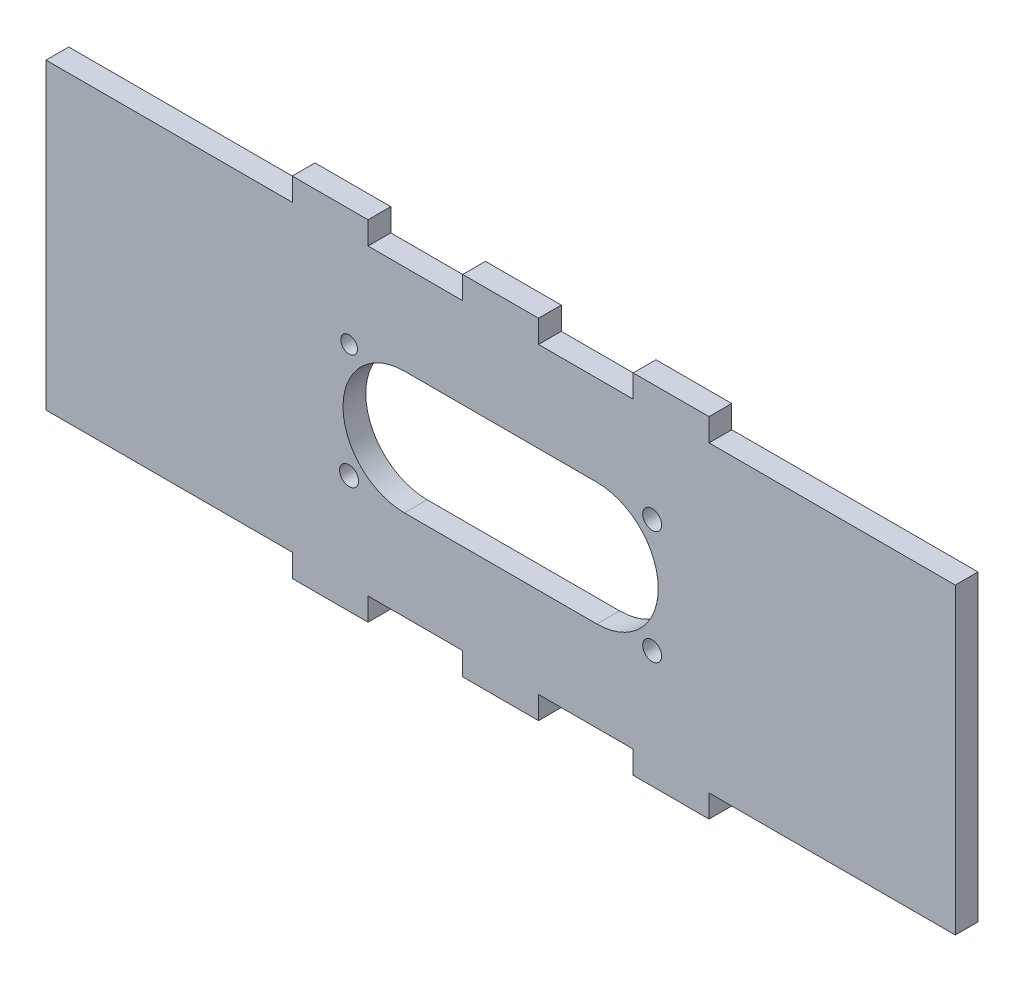
ISO-10303-21;
HEADER;
FILE_DESCRIPTION(('STEP AP214'),'2;1');
FILE_NAME('part.step','',(''),(''),'','','');
FILE_SCHEMA(('AUTOMOTIVE_DESIGN { 1 0 10303 214 1 1 1 1 }'));
ENDSEC;
DATA;
#1=APPLICATION_CONTEXT('core data for automotive mechanical design processes');
#2=APPLICATION_PROTOCOL_DEFINITION('international standard','automotive_design',2000,#1);
#3=PRODUCT_CONTEXT('',#1,'mechanical');
#4=PRODUCT('Part','Part','',(#3));
#5=PRODUCT_RELATED_PRODUCT_CATEGORY('part','',(#4));
#6=PRODUCT_DEFINITION_FORMATION('','',#4);
#7=PRODUCT_DEFINITION_CONTEXT('part definition',#1,'design');
#8=PRODUCT_DEFINITION('design','',#6,#7);
#9=PRODUCT_DEFINITION_SHAPE('','',#8);
#10=(LENGTH_UNIT() NAMED_UNIT(*) SI_UNIT(.MILLI.,.METRE.));
#11=(NAMED_UNIT(*) PLANE_ANGLE_UNIT() SI_UNIT($,.RADIAN.));
#12=(NAMED_UNIT(*) SI_UNIT($,.STERADIAN.) SOLID_ANGLE_UNIT());
#13=UNCERTAINTY_MEASURE_WITH_UNIT(LENGTH_MEASURE(1.E-05),#10,'distance_accuracy_value','');
#14=(GEOMETRIC_REPRESENTATION_CONTEXT(3) GLOBAL_UNCERTAINTY_ASSIGNED_CONTEXT((#13)) GLOBAL_UNIT_ASSIGNED_CONTEXT((#10,
#11,#12)) REPRESENTATION_CONTEXT('',''));
#15=CARTESIAN_POINT('',(0.,0.,0.));
#16=DIRECTION('',(0.,0.,1.));
#17=DIRECTION('',(1.,0.,0.));
#18=AXIS2_PLACEMENT_3D('',#15,#16,#17);
#19=CARTESIAN_POINT('',(-12.7,0.,0.));
#20=DIRECTION('',(0.,0.,1.));
#21=DIRECTION('',(1.,0.,0.));
#22=AXIS2_PLACEMENT_3D('',#19,#20,#21);
#23=CYLINDRICAL_SURFACE('',#22,8.1);
#24=DIRECTION('',(0.,0.,1.));
#25=VECTOR('',#24,1.);
#26=CARTESIAN_POINT('',(-12.7,8.1,0.));
#27=LINE('',#26,#25);
#28=CARTESIAN_POINT('',(-12.7,8.1,0.));
#29=VERTEX_POINT('',#28);
#30=CARTESIAN_POINT('',(-12.7,8.1,3.));
#31=VERTEX_POINT('',#30);
#32=EDGE_CURVE('E1123',#29,#31,#27,.T.);
#33=ORIENTED_EDGE('',*,*,#32,.T.);
#34=CARTESIAN_POINT('',(-12.7,0.,3.));
#35=DIRECTION('',(0.,0.,1.));
#36=DIRECTION('',(1.,0.,0.));
#37=AXIS2_PLACEMENT_3D('',#34,#35,#36);
#38=CIRCLE('',#37,8.1);
#39=CARTESIAN_POINT('',(-12.7,-8.1,3.));
#40=VERTEX_POINT('',#39);
#41=EDGE_CURVE('E267',#31,#40,#38,.T.);
#42=ORIENTED_EDGE('',*,*,#41,.T.);
#43=DIRECTION('',(0.,0.,1.));
#44=VECTOR('',#43,1.);
#45=CARTESIAN_POINT('',(-12.7,-8.1,0.));
#46=LINE('',#45,#44);
#47=CARTESIAN_POINT('',(-12.7,-8.1,0.));
#48=VERTEX_POINT('',#47);
#49=EDGE_CURVE('E252',#48,#40,#46,.T.);
#50=ORIENTED_EDGE('',*,*,#49,.F.);
#51=CARTESIAN_POINT('',(-12.7,0.,0.));
#52=DIRECTION('',(0.,0.,1.));
#53=DIRECTION('',(1.,0.,0.));
#54=AXIS2_PLACEMENT_3D('',#51,#52,#53);
#55=CIRCLE('',#54,8.1);
#56=EDGE_CURVE('E265',#29,#48,#55,.T.);
#57=ORIENTED_EDGE('',*,*,#56,.F.);
#58=EDGE_LOOP('',(#33,#42,#50,#57));
#59=FACE_BOUND('',#58,.T.);
#60=ADVANCED_FACE('F41',(#59),#23,.F.);
#61=CARTESIAN_POINT('',(-60.,0.,3.));
#62=DIRECTION('',(1.,0.,0.));
#63=DIRECTION('',(0.,0.,-1.));
#64=AXIS2_PLACEMENT_3D('',#61,#62,#63);
#65=PLANE('',#64);
#66=DIRECTION('',(0.,-1.,0.));
#67=VECTOR('',#66,1.);
#68=CARTESIAN_POINT('',(-60.,0.,0.));
#69=LINE('',#68,#67);
#70=CARTESIAN_POINT('',(-60.,20.,0.));
#71=VERTEX_POINT('',#70);
#72=CARTESIAN_POINT('',(-60.,-20.,0.));
#73=VERTEX_POINT('',#72);
#74=EDGE_CURVE('E295',#71,#73,#69,.T.);
#75=ORIENTED_EDGE('',*,*,#74,.T.);
#76=DIRECTION('',(0.,0.,-1.));
#77=VECTOR('',#76,1.);
#78=CARTESIAN_POINT('',(-60.,-20.,3.));
#79=LINE('',#78,#77);
#80=CARTESIAN_POINT('',(-60.,-20.,3.));
#81=VERTEX_POINT('',#80);
#82=EDGE_CURVE('E11',#81,#73,#79,.T.);
#83=ORIENTED_EDGE('',*,*,#82,.F.);
#84=DIRECTION('',(0.,-1.,0.));
#85=VECTOR('',#84,1.);
#86=CARTESIAN_POINT('',(-60.,0.,3.));
#87=LINE('',#86,#85);
#88=CARTESIAN_POINT('',(-60.,20.,3.));
#89=VERTEX_POINT('',#88);
#90=EDGE_CURVE('E297',#89,#81,#87,.T.);
#91=ORIENTED_EDGE('',*,*,#90,.F.);
#92=DIRECTION('',(0.,0.,-1.));
#93=VECTOR('',#92,1.);
#94=CARTESIAN_POINT('',(-60.,20.,3.));
#95=LINE('',#94,#93);
#96=EDGE_CURVE('E470',#89,#71,#95,.T.);
#97=ORIENTED_EDGE('',*,*,#96,.T.);
#98=EDGE_LOOP('',(#75,#83,#91,#97));
#99=FACE_BOUND('',#98,.T.);
#100=ADVANCED_FACE('F43',(#99),#65,.F.);
#101=CARTESIAN_POINT('',(0.,-20.,3.));
#102=DIRECTION('',(0.,1.,0.));
#103=DIRECTION('',(0.,0.,1.));
#104=AXIS2_PLACEMENT_3D('',#101,#102,#103);
#105=PLANE('',#104);
#106=DIRECTION('',(1.,0.,0.));
#107=VECTOR('',#106,1.);
#108=CARTESIAN_POINT('',(0.,-20.,0.));
#109=LINE('',#108,#107);
#110=CARTESIAN_POINT('',(-27.5,-20.,0.));
#111=VERTEX_POINT('',#110);
#112=EDGE_CURVE('E385',#73,#111,#109,.T.);
#113=ORIENTED_EDGE('',*,*,#112,.T.);
#114=DIRECTION('',(0.,0.,-1.));
#115=VECTOR('',#114,1.);
#116=CARTESIAN_POINT('',(-27.5,-20.,3.));
#117=LINE('',#116,#115);
#118=CARTESIAN_POINT('',(-27.5,-20.,3.));
#119=VERTEX_POINT('',#118);
#120=EDGE_CURVE('E50',#119,#111,#117,.T.);
#121=ORIENTED_EDGE('',*,*,#120,.F.);
#122=DIRECTION('',(1.,0.,0.));
#123=VECTOR('',#122,1.);
#124=CARTESIAN_POINT('',(0.,-20.,3.));
#125=LINE('',#124,#123);
#126=EDGE_CURVE('E301',#81,#119,#125,.T.);
#127=ORIENTED_EDGE('',*,*,#126,.F.);
#128=ORIENTED_EDGE('',*,*,#82,.T.);
#129=EDGE_LOOP('',(#113,#121,#127,#128));
#130=FACE_BOUND('',#129,.T.);
#131=ADVANCED_FACE('F576',(#130),#105,.F.);
#132=CARTESIAN_POINT('',(-27.5,0.,3.));
#133=DIRECTION('',(1.,0.,0.));
#134=DIRECTION('',(0.,0.,-1.));
#135=AXIS2_PLACEMENT_3D('',#132,#133,#134);
#136=PLANE('',#135);
#137=DIRECTION('',(0.,-1.,0.));
#138=VECTOR('',#137,1.);
#139=CARTESIAN_POINT('',(-27.5,0.,0.));
#140=LINE('',#139,#138);
#141=CARTESIAN_POINT('',(-27.5,-23.,0.));
#142=VERTEX_POINT('',#141);
#143=EDGE_CURVE('E388',#111,#142,#140,.T.);
#144=ORIENTED_EDGE('',*,*,#143,.T.);
#145=DIRECTION('',(0.,0.,-1.));
#146=VECTOR('',#145,1.);
#147=CARTESIAN_POINT('',(-27.5,-23.,3.));
#148=LINE('',#147,#146);
#149=CARTESIAN_POINT('',(-27.5,-23.,3.));
#150=VERTEX_POINT('',#149);
#151=EDGE_CURVE('E549',#150,#142,#148,.T.);
#152=ORIENTED_EDGE('',*,*,#151,.F.);
#153=DIRECTION('',(0.,-1.,0.));
#154=VECTOR('',#153,1.);
#155=CARTESIAN_POINT('',(-27.5,0.,3.));
#156=LINE('',#155,#154);
#157=EDGE_CURVE('E305',#119,#150,#156,.T.);
#158=ORIENTED_EDGE('',*,*,#157,.F.);
#159=ORIENTED_EDGE('',*,*,#120,.T.);
#160=EDGE_LOOP('',(#144,#152,#158,#159));
#161=FACE_BOUND('',#160,.T.);
#162=ADVANCED_FACE('F558',(#161),#136,.F.);
#163=CARTESIAN_POINT('',(0.,-23.,3.));
#164=DIRECTION('',(0.,1.,0.));
#165=DIRECTION('',(0.,0.,1.));
#166=AXIS2_PLACEMENT_3D('',#163,#164,#165);
#167=PLANE('',#166);
#168=DIRECTION('',(1.,0.,0.));
#169=VECTOR('',#168,1.);
#170=CARTESIAN_POINT('',(0.,-23.,0.));
#171=LINE('',#170,#169);
#172=CARTESIAN_POINT('',(-17.5,-23.,0.));
#173=VERTEX_POINT('',#172);
#174=EDGE_CURVE('E393',#142,#173,#171,.T.);
#175=ORIENTED_EDGE('',*,*,#174,.T.);
#176=DIRECTION('',(0.,0.,-1.));
#177=VECTOR('',#176,1.);
#178=CARTESIAN_POINT('',(-17.5,-23.,3.));
#179=LINE('',#178,#177);
#180=CARTESIAN_POINT('',(-17.5,-23.,3.));
#181=VERTEX_POINT('',#180);
#182=EDGE_CURVE('E546',#181,#173,#179,.T.);
#183=ORIENTED_EDGE('',*,*,#182,.F.);
#184=DIRECTION('',(1.,0.,0.));
#185=VECTOR('',#184,1.);
#186=CARTESIAN_POINT('',(0.,-23.,3.));
#187=LINE('',#186,#185);
#188=EDGE_CURVE('E310',#150,#181,#187,.T.);
#189=ORIENTED_EDGE('',*,*,#188,.F.);
#190=ORIENTED_EDGE('',*,*,#151,.T.);
#191=EDGE_LOOP('',(#175,#183,#189,#190));
#192=FACE_BOUND('',#191,.T.);
#193=ADVANCED_FACE('F568',(#192),#167,.F.);
#194=CARTESIAN_POINT('',(-17.5,0.,3.));
#195=DIRECTION('',(1.,0.,0.));
#196=DIRECTION('',(0.,0.,-1.));
#197=AXIS2_PLACEMENT_3D('',#194,#195,#196);
#198=PLANE('',#197);
#199=DIRECTION('',(0.,-1.,0.));
#200=VECTOR('',#199,1.);
#201=CARTESIAN_POINT('',(-17.5,0.,0.));
#202=LINE('',#201,#200);
#203=CARTESIAN_POINT('',(-17.5,-20.,0.));
#204=VERTEX_POINT('',#203);
#205=EDGE_CURVE('E397',#204,#173,#202,.T.);
#206=ORIENTED_EDGE('',*,*,#205,.F.);
#207=DIRECTION('',(0.,0.,-1.));
#208=VECTOR('',#207,1.);
#209=CARTESIAN_POINT('',(-17.5,-20.,3.));
#210=LINE('',#209,#208);
#211=CARTESIAN_POINT('',(-17.5,-20.,3.));
#212=VERTEX_POINT('',#211);
#213=EDGE_CURVE('E543',#212,#204,#210,.T.);
#214=ORIENTED_EDGE('',*,*,#213,.F.);
#215=DIRECTION('',(0.,-1.,0.));
#216=VECTOR('',#215,1.);
#217=CARTESIAN_POINT('',(-17.5,0.,3.));
#218=LINE('',#217,#216);
#219=EDGE_CURVE('E313',#212,#181,#218,.T.);
#220=ORIENTED_EDGE('',*,*,#219,.T.);
#221=ORIENTED_EDGE('',*,*,#182,.T.);
#222=EDGE_LOOP('',(#206,#214,#220,#221));
#223=FACE_BOUND('',#222,.T.);
#224=ADVANCED_FACE('F1038',(#223),#198,.T.);
#225=CARTESIAN_POINT('',(-5.,-20.,0.));
#226=VERTEX_POINT('',#225);
#227=EDGE_CURVE('E390',#204,#226,#109,.T.);
#228=ORIENTED_EDGE('',*,*,#227,.T.);
#229=DIRECTION('',(0.,0.,-1.));
#230=VECTOR('',#229,1.);
#231=CARTESIAN_POINT('',(-5.,-20.,3.));
#232=LINE('',#231,#230);
#233=CARTESIAN_POINT('',(-5.,-20.,3.));
#234=VERTEX_POINT('',#233);
#235=EDGE_CURVE('E539',#234,#226,#232,.T.);
#236=ORIENTED_EDGE('',*,*,#235,.F.);
#237=EDGE_CURVE('E307',#212,#234,#125,.T.);
#238=ORIENTED_EDGE('',*,*,#237,.F.);
#239=ORIENTED_EDGE('',*,*,#213,.T.);
#240=EDGE_LOOP('',(#228,#236,#238,#239));
#241=FACE_BOUND('',#240,.T.);
#242=ADVANCED_FACE('F649',(#241),#105,.F.);
#243=CARTESIAN_POINT('',(-5.,0.,3.));
#244=DIRECTION('',(1.,0.,0.));
#245=DIRECTION('',(0.,0.,-1.));
#246=AXIS2_PLACEMENT_3D('',#243,#244,#245);
#247=PLANE('',#246);
#248=DIRECTION('',(0.,-1.,0.));
#249=VECTOR('',#248,1.);
#250=CARTESIAN_POINT('',(-5.,0.,0.));
#251=LINE('',#250,#249);
#252=CARTESIAN_POINT('',(-5.,-23.,0.));
#253=VERTEX_POINT('',#252);
#254=EDGE_CURVE('E401',#226,#253,#251,.T.);
#255=ORIENTED_EDGE('',*,*,#254,.T.);
#256=DIRECTION('',(0.,0.,-1.));
#257=VECTOR('',#256,1.);
#258=CARTESIAN_POINT('',(-5.,-23.,3.));
#259=LINE('',#258,#257);
#260=CARTESIAN_POINT('',(-5.,-23.,3.));
#261=VERTEX_POINT('',#260);
#262=EDGE_CURVE('E535',#261,#253,#259,.T.);
#263=ORIENTED_EDGE('',*,*,#262,.F.);
#264=DIRECTION('',(0.,-1.,0.));
#265=VECTOR('',#264,1.);
#266=CARTESIAN_POINT('',(-5.,0.,3.));
#267=LINE('',#266,#265);
#268=EDGE_CURVE('E317',#234,#261,#267,.T.);
#269=ORIENTED_EDGE('',*,*,#268,.F.);
#270=ORIENTED_EDGE('',*,*,#235,.T.);
#271=EDGE_LOOP('',(#255,#263,#269,#270));
#272=FACE_BOUND('',#271,.T.);
#273=ADVANCED_FACE('F654',(#272),#247,.F.);
#274=CARTESIAN_POINT('',(0.,-23.,3.));
#275=DIRECTION('',(0.,1.,0.));
#276=DIRECTION('',(0.,0.,1.));
#277=AXIS2_PLACEMENT_3D('',#274,#275,#276);
#278=PLANE('',#277);
#279=DIRECTION('',(1.,0.,0.));
#280=VECTOR('',#279,1.);
#281=CARTESIAN_POINT('',(0.,-23.,0.));
#282=LINE('',#281,#280);
#283=CARTESIAN_POINT('',(5.,-23.,0.));
#284=VERTEX_POINT('',#283);
#285=EDGE_CURVE('E404',#253,#284,#282,.T.);
#286=ORIENTED_EDGE('',*,*,#285,.T.);
#287=DIRECTION('',(0.,0.,-1.));
#288=VECTOR('',#287,1.);
#289=CARTESIAN_POINT('',(5.,-23.,3.));
#290=LINE('',#289,#288);
#291=CARTESIAN_POINT('',(5.,-23.,3.));
#292=VERTEX_POINT('',#291);
#293=EDGE_CURVE('E532',#292,#284,#290,.T.);
#294=ORIENTED_EDGE('',*,*,#293,.F.);
#295=DIRECTION('',(1.,0.,0.));
#296=VECTOR('',#295,1.);
#297=CARTESIAN_POINT('',(0.,-23.,3.));
#298=LINE('',#297,#296);
#299=EDGE_CURVE('E320',#261,#292,#298,.T.);
#300=ORIENTED_EDGE('',*,*,#299,.F.);
#301=ORIENTED_EDGE('',*,*,#262,.T.);
#302=EDGE_LOOP('',(#286,#294,#300,#301));
#303=FACE_BOUND('',#302,.T.);
#304=ADVANCED_FACE('F659',(#303),#278,.F.);
#305=CARTESIAN_POINT('',(5.,0.,3.));
#306=DIRECTION('',(1.,0.,0.));
#307=DIRECTION('',(0.,0.,-1.));
#308=AXIS2_PLACEMENT_3D('',#305,#306,#307);
#309=PLANE('',#308);
#310=DIRECTION('',(0.,-1.,0.));
#311=VECTOR('',#310,1.);
#312=CARTESIAN_POINT('',(5.,0.,0.));
#313=LINE('',#312,#311);
#314=CARTESIAN_POINT('',(5.,-20.,0.));
#315=VERTEX_POINT('',#314);
#316=EDGE_CURVE('E408',#315,#284,#313,.T.);
#317=ORIENTED_EDGE('',*,*,#316,.F.);
#318=DIRECTION('',(0.,0.,-1.));
#319=VECTOR('',#318,1.);
#320=CARTESIAN_POINT('',(5.,-20.,3.));
#321=LINE('',#320,#319);
#322=CARTESIAN_POINT('',(5.,-20.,3.));
#323=VERTEX_POINT('',#322);
#324=EDGE_CURVE('E529',#323,#315,#321,.T.);
#325=ORIENTED_EDGE('',*,*,#324,.F.);
#326=DIRECTION('',(0.,-1.,0.));
#327=VECTOR('',#326,1.);
#328=CARTESIAN_POINT('',(5.,0.,3.));
#329=LINE('',#328,#327);
#330=EDGE_CURVE('E323',#323,#292,#329,.T.);
#331=ORIENTED_EDGE('',*,*,#330,.T.);
#332=ORIENTED_EDGE('',*,*,#293,.T.);
#333=EDGE_LOOP('',(#317,#325,#331,#332));
#334=FACE_BOUND('',#333,.T.);
#335=ADVANCED_FACE('F675',(#334),#309,.T.);
#336=CARTESIAN_POINT('',(17.5,-20.,0.));
#337=VERTEX_POINT('',#336);
#338=EDGE_CURVE('E412',#315,#337,#109,.T.);
#339=ORIENTED_EDGE('',*,*,#338,.T.);
#340=DIRECTION('',(0.,0.,-1.));
#341=VECTOR('',#340,1.);
#342=CARTESIAN_POINT('',(17.5,-20.,3.));
#343=LINE('',#342,#341);
#344=CARTESIAN_POINT('',(17.5,-20.,3.));
#345=VERTEX_POINT('',#344);
#346=EDGE_CURVE('E525',#345,#337,#343,.T.);
#347=ORIENTED_EDGE('',*,*,#346,.F.);
#348=EDGE_CURVE('E327',#323,#345,#125,.T.);
#349=ORIENTED_EDGE('',*,*,#348,.F.);
#350=ORIENTED_EDGE('',*,*,#324,.T.);
#351=EDGE_LOOP('',(#339,#347,#349,#350));
#352=FACE_BOUND('',#351,.T.);
#353=ADVANCED_FACE('F643',(#352),#105,.F.);
#354=CARTESIAN_POINT('',(17.5,0.,3.));
#355=DIRECTION('',(1.,0.,0.));
#356=DIRECTION('',(0.,0.,-1.));
#357=AXIS2_PLACEMENT_3D('',#354,#355,#356);
#358=PLANE('',#357);
#359=DIRECTION('',(0.,-1.,0.));
#360=VECTOR('',#359,1.);
#361=CARTESIAN_POINT('',(17.5,0.,0.));
#362=LINE('',#361,#360);
#363=CARTESIAN_POINT('',(17.5,-23.,0.));
#364=VERTEX_POINT('',#363);
#365=EDGE_CURVE('E413',#337,#364,#362,.T.);
#366=ORIENTED_EDGE('',*,*,#365,.T.);
#367=DIRECTION('',(0.,0.,-1.));
#368=VECTOR('',#367,1.);
#369=CARTESIAN_POINT('',(17.5,-23.,3.));
#370=LINE('',#369,#368);
#371=CARTESIAN_POINT('',(17.5,-23.,3.));
#372=VERTEX_POINT('',#371);
#373=EDGE_CURVE('E521',#372,#364,#370,.T.);
#374=ORIENTED_EDGE('',*,*,#373,.F.);
#375=DIRECTION('',(0.,-1.,0.));
#376=VECTOR('',#375,1.);
#377=CARTESIAN_POINT('',(17.5,0.,3.));
#378=LINE('',#377,#376);
#379=EDGE_CURVE('E328',#345,#372,#378,.T.);
#380=ORIENTED_EDGE('',*,*,#379,.F.);
#381=ORIENTED_EDGE('',*,*,#346,.T.);
#382=EDGE_LOOP('',(#366,#374,#380,#381));
#383=FACE_BOUND('',#382,.T.);
#384=ADVANCED_FACE('F638',(#383),#358,.F.);
#385=CARTESIAN_POINT('',(0.,-23.,3.));
#386=DIRECTION('',(0.,1.,0.));
#387=DIRECTION('',(0.,0.,1.));
#388=AXIS2_PLACEMENT_3D('',#385,#386,#387);
#389=PLANE('',#388);
#390=DIRECTION('',(1.,0.,0.));
#391=VECTOR('',#390,1.);
#392=CARTESIAN_POINT('',(0.,-23.,0.));
#393=LINE('',#392,#391);
#394=CARTESIAN_POINT('',(27.5,-23.,0.));
#395=VERTEX_POINT('',#394);
#396=EDGE_CURVE('E416',#364,#395,#393,.T.);
#397=ORIENTED_EDGE('',*,*,#396,.T.);
#398=DIRECTION('',(0.,0.,-1.));
#399=VECTOR('',#398,1.);
#400=CARTESIAN_POINT('',(27.5,-23.,3.));
#401=LINE('',#400,#399);
#402=CARTESIAN_POINT('',(27.5,-23.,3.));
#403=VERTEX_POINT('',#402);
#404=EDGE_CURVE('E518',#403,#395,#401,.T.);
#405=ORIENTED_EDGE('',*,*,#404,.F.);
#406=DIRECTION('',(1.,0.,0.));
#407=VECTOR('',#406,1.);
#408=CARTESIAN_POINT('',(0.,-23.,3.));
#409=LINE('',#408,#407);
#410=EDGE_CURVE('E331',#372,#403,#409,.T.);
#411=ORIENTED_EDGE('',*,*,#410,.F.);
#412=ORIENTED_EDGE('',*,*,#373,.T.);
#413=EDGE_LOOP('',(#397,#405,#411,#412));
#414=FACE_BOUND('',#413,.T.);
#415=ADVANCED_FACE('F632',(#414),#389,.F.);
#416=CARTESIAN_POINT('',(27.5,0.,3.));
#417=DIRECTION('',(1.,0.,0.));
#418=DIRECTION('',(0.,0.,-1.));
#419=AXIS2_PLACEMENT_3D('',#416,#417,#418);
#420=PLANE('',#419);
#421=DIRECTION('',(0.,-1.,0.));
#422=VECTOR('',#421,1.);
#423=CARTESIAN_POINT('',(27.5,0.,0.));
#424=LINE('',#423,#422);
#425=CARTESIAN_POINT('',(27.5,-20.,0.));
#426=VERTEX_POINT('',#425);
#427=EDGE_CURVE('E420',#426,#395,#424,.T.);
#428=ORIENTED_EDGE('',*,*,#427,.F.);
#429=DIRECTION('',(0.,0.,-1.));
#430=VECTOR('',#429,1.);
#431=CARTESIAN_POINT('',(27.5,-20.,3.));
#432=LINE('',#431,#430);
#433=CARTESIAN_POINT('',(27.5,-20.,3.));
#434=VERTEX_POINT('',#433);
#435=EDGE_CURVE('E515',#434,#426,#432,.T.);
#436=ORIENTED_EDGE('',*,*,#435,.F.);
#437=DIRECTION('',(0.,-1.,0.));
#438=VECTOR('',#437,1.);
#439=CARTESIAN_POINT('',(27.5,0.,3.));
#440=LINE('',#439,#438);
#441=EDGE_CURVE('E334',#434,#403,#440,.T.);
#442=ORIENTED_EDGE('',*,*,#441,.T.);
#443=ORIENTED_EDGE('',*,*,#404,.T.);
#444=EDGE_LOOP('',(#428,#436,#442,#443));
#445=FACE_BOUND('',#444,.T.);
#446=ADVANCED_FACE('F626',(#445),#420,.T.);
#447=CARTESIAN_POINT('',(60.,-20.,0.));
#448=VERTEX_POINT('',#447);
#449=EDGE_CURVE('E389',#426,#448,#109,.T.);
#450=ORIENTED_EDGE('',*,*,#449,.T.);
#451=DIRECTION('',(0.,0.,-1.));
#452=VECTOR('',#451,1.);
#453=CARTESIAN_POINT('',(60.,-20.,3.));
#454=LINE('',#453,#452);
#455=CARTESIAN_POINT('',(60.,-20.,3.));
#456=VERTEX_POINT('',#455);
#457=EDGE_CURVE('E512',#456,#448,#454,.T.);
#458=ORIENTED_EDGE('',*,*,#457,.F.);
#459=EDGE_CURVE('E306',#434,#456,#125,.T.);
#460=ORIENTED_EDGE('',*,*,#459,.F.);
#461=ORIENTED_EDGE('',*,*,#435,.T.);
#462=EDGE_LOOP('',(#450,#458,#460,#461));
#463=FACE_BOUND('',#462,.T.);
#464=ADVANCED_FACE('F664',(#463),#105,.F.);
#465=CARTESIAN_POINT('',(60.,0.,3.));
#466=DIRECTION('',(1.,0.,0.));
#467=DIRECTION('',(0.,0.,-1.));
#468=AXIS2_PLACEMENT_3D('',#465,#466,#467);
#469=PLANE('',#468);
#470=DIRECTION('',(0.,-1.,0.));
#471=VECTOR('',#470,1.);
#472=CARTESIAN_POINT('',(60.,0.,0.));
#473=LINE('',#472,#471);
#474=CARTESIAN_POINT('',(60.,20.,0.));
#475=VERTEX_POINT('',#474);
#476=EDGE_CURVE('E424',#475,#448,#473,.T.);
#477=ORIENTED_EDGE('',*,*,#476,.F.);
#478=DIRECTION('',(0.,0.,-1.));
#479=VECTOR('',#478,1.);
#480=CARTESIAN_POINT('',(60.,20.,3.));
#481=LINE('',#480,#479);
#482=CARTESIAN_POINT('',(60.,20.,3.));
#483=VERTEX_POINT('',#482);
#484=EDGE_CURVE('E509',#483,#475,#481,.T.);
#485=ORIENTED_EDGE('',*,*,#484,.F.);
#486=DIRECTION('',(0.,-1.,0.));
#487=VECTOR('',#486,1.);
#488=CARTESIAN_POINT('',(60.,0.,3.));
#489=LINE('',#488,#487);
#490=EDGE_CURVE('E338',#483,#456,#489,.T.);
#491=ORIENTED_EDGE('',*,*,#490,.T.);
#492=ORIENTED_EDGE('',*,*,#457,.T.);
#493=EDGE_LOOP('',(#477,#485,#491,#492));
#494=FACE_BOUND('',#493,.T.);
#495=ADVANCED_FACE('F617',(#494),#469,.T.);
#496=CARTESIAN_POINT('',(0.,20.,3.));
#497=DIRECTION('',(0.,1.,0.));
#498=DIRECTION('',(0.,0.,1.));
#499=AXIS2_PLACEMENT_3D('',#496,#497,#498);
#500=PLANE('',#499);
#501=DIRECTION('',(1.,0.,0.));
#502=VECTOR('',#501,1.);
#503=CARTESIAN_POINT('',(0.,20.,0.));
#504=LINE('',#503,#502);
#505=CARTESIAN_POINT('',(27.5,20.,0.));
#506=VERTEX_POINT('',#505);
#507=EDGE_CURVE('E428',#506,#475,#504,.T.);
#508=ORIENTED_EDGE('',*,*,#507,.F.);
#509=DIRECTION('',(0.,0.,-1.));
#510=VECTOR('',#509,1.);
#511=CARTESIAN_POINT('',(27.5,20.,3.));
#512=LINE('',#511,#510);
#513=CARTESIAN_POINT('',(27.5,20.,3.));
#514=VERTEX_POINT('',#513);
#515=EDGE_CURVE('E506',#514,#506,#512,.T.);
#516=ORIENTED_EDGE('',*,*,#515,.F.);
#517=DIRECTION('',(1.,0.,0.));
#518=VECTOR('',#517,1.);
#519=CARTESIAN_POINT('',(0.,20.,3.));
#520=LINE('',#519,#518);
#521=EDGE_CURVE('E342',#514,#483,#520,.T.);
#522=ORIENTED_EDGE('',*,*,#521,.T.);
#523=ORIENTED_EDGE('',*,*,#484,.T.);
#524=EDGE_LOOP('',(#508,#516,#522,#523));
#525=FACE_BOUND('',#524,.T.);
#526=ADVANCED_FACE('F611',(#525),#500,.T.);
#527=CARTESIAN_POINT('',(27.5,0.,3.));
#528=DIRECTION('',(-1.,0.,0.));
#529=DIRECTION('',(0.,0.,1.));
#530=AXIS2_PLACEMENT_3D('',#527,#528,#529);
#531=PLANE('',#530);
#532=DIRECTION('',(0.,1.,0.));
#533=VECTOR('',#532,1.);
#534=CARTESIAN_POINT('',(27.5,0.,0.));
#535=LINE('',#534,#533);
#536=CARTESIAN_POINT('',(27.5,23.,0.));
#537=VERTEX_POINT('',#536);
#538=EDGE_CURVE('E432',#506,#537,#535,.T.);
#539=ORIENTED_EDGE('',*,*,#538,.T.);
#540=DIRECTION('',(0.,0.,-1.));
#541=VECTOR('',#540,1.);
#542=CARTESIAN_POINT('',(27.5,23.,3.));
#543=LINE('',#542,#541);
#544=CARTESIAN_POINT('',(27.5,23.,3.));
#545=VERTEX_POINT('',#544);
#546=EDGE_CURVE('E503',#545,#537,#543,.T.);
#547=ORIENTED_EDGE('',*,*,#546,.F.);
#548=DIRECTION('',(0.,1.,0.));
#549=VECTOR('',#548,1.);
#550=CARTESIAN_POINT('',(27.5,0.,3.));
#551=LINE('',#550,#549);
#552=EDGE_CURVE('E346',#514,#545,#551,.T.);
#553=ORIENTED_EDGE('',*,*,#552,.F.);
#554=ORIENTED_EDGE('',*,*,#515,.T.);
#555=EDGE_LOOP('',(#539,#547,#553,#554));
#556=FACE_BOUND('',#555,.T.);
#557=ADVANCED_FACE('F732',(#556),#531,.F.);
#558=CARTESIAN_POINT('',(0.,23.,3.));
#559=DIRECTION('',(0.,1.,0.));
#560=DIRECTION('',(0.,0.,1.));
#561=AXIS2_PLACEMENT_3D('',#558,#559,#560);
#562=PLANE('',#561);
#563=DIRECTION('',(1.,0.,0.));
#564=VECTOR('',#563,1.);
#565=CARTESIAN_POINT('',(0.,23.,0.));
#566=LINE('',#565,#564);
#567=CARTESIAN_POINT('',(17.5,23.,0.));
#568=VERTEX_POINT('',#567);
#569=EDGE_CURVE('E437',#568,#537,#566,.T.);
#570=ORIENTED_EDGE('',*,*,#569,.F.);
#571=DIRECTION('',(0.,0.,-1.));
#572=VECTOR('',#571,1.);
#573=CARTESIAN_POINT('',(17.5,23.,3.));
#574=LINE('',#573,#572);
#575=CARTESIAN_POINT('',(17.5,23.,3.));
#576=VERTEX_POINT('',#575);
#577=EDGE_CURVE('E500',#576,#568,#574,.T.);
#578=ORIENTED_EDGE('',*,*,#577,.F.);
#579=DIRECTION('',(1.,0.,0.));
#580=VECTOR('',#579,1.);
#581=CARTESIAN_POINT('',(0.,23.,3.));
#582=LINE('',#581,#580);
#583=EDGE_CURVE('E351',#576,#545,#582,.T.);
#584=ORIENTED_EDGE('',*,*,#583,.T.);
#585=ORIENTED_EDGE('',*,*,#546,.T.);
#586=EDGE_LOOP('',(#570,#578,#584,#585));
#587=FACE_BOUND('',#586,.T.);
#588=ADVANCED_FACE('F605',(#587),#562,.T.);
#589=CARTESIAN_POINT('',(17.5,0.,3.));
#590=DIRECTION('',(-1.,0.,0.));
#591=DIRECTION('',(0.,0.,1.));
#592=AXIS2_PLACEMENT_3D('',#589,#590,#591);
#593=PLANE('',#592);
#594=DIRECTION('',(0.,1.,0.));
#595=VECTOR('',#594,1.);
#596=CARTESIAN_POINT('',(17.5,0.,0.));
#597=LINE('',#596,#595);
#598=CARTESIAN_POINT('',(17.5,20.,0.));
#599=VERTEX_POINT('',#598);
#600=EDGE_CURVE('E441',#599,#568,#597,.T.);
#601=ORIENTED_EDGE('',*,*,#600,.F.);
#602=DIRECTION('',(0.,0.,-1.));
#603=VECTOR('',#602,1.);
#604=CARTESIAN_POINT('',(17.5,20.,3.));
#605=LINE('',#604,#603);
#606=CARTESIAN_POINT('',(17.5,20.,3.));
#607=VERTEX_POINT('',#606);
#608=EDGE_CURVE('E497',#607,#599,#605,.T.);
#609=ORIENTED_EDGE('',*,*,#608,.F.);
#610=DIRECTION('',(0.,1.,0.));
#611=VECTOR('',#610,1.);
#612=CARTESIAN_POINT('',(17.5,0.,3.));
#613=LINE('',#612,#611);
#614=EDGE_CURVE('E355',#607,#576,#613,.T.);
#615=ORIENTED_EDGE('',*,*,#614,.T.);
#616=ORIENTED_EDGE('',*,*,#577,.T.);
#617=EDGE_LOOP('',(#601,#609,#615,#616));
#618=FACE_BOUND('',#617,.T.);
#619=ADVANCED_FACE('F601',(#618),#593,.T.);
#620=CARTESIAN_POINT('',(5.,20.,0.));
#621=VERTEX_POINT('',#620);
#622=EDGE_CURVE('E433',#621,#599,#504,.T.);
#623=ORIENTED_EDGE('',*,*,#622,.F.);
#624=DIRECTION('',(0.,0.,-1.));
#625=VECTOR('',#624,1.);
#626=CARTESIAN_POINT('',(5.,20.,3.));
#627=LINE('',#626,#625);
#628=CARTESIAN_POINT('',(5.,20.,3.));
#629=VERTEX_POINT('',#628);
#630=EDGE_CURVE('E494',#629,#621,#627,.T.);
#631=ORIENTED_EDGE('',*,*,#630,.F.);
#632=EDGE_CURVE('E348',#629,#607,#520,.T.);
#633=ORIENTED_EDGE('',*,*,#632,.T.);
#634=ORIENTED_EDGE('',*,*,#608,.T.);
#635=EDGE_LOOP('',(#623,#631,#633,#634));
#636=FACE_BOUND('',#635,.T.);
#637=ADVANCED_FACE('F595',(#636),#500,.T.);
#638=CARTESIAN_POINT('',(5.,0.,3.));
#639=DIRECTION('',(-1.,0.,0.));
#640=DIRECTION('',(0.,0.,1.));
#641=AXIS2_PLACEMENT_3D('',#638,#639,#640);
#642=PLANE('',#641);
#643=DIRECTION('',(0.,1.,0.));
#644=VECTOR('',#643,1.);
#645=CARTESIAN_POINT('',(5.,0.,0.));
#646=LINE('',#645,#644);
#647=CARTESIAN_POINT('',(5.,23.,0.));
#648=VERTEX_POINT('',#647);
#649=EDGE_CURVE('E445',#621,#648,#646,.T.);
#650=ORIENTED_EDGE('',*,*,#649,.T.);
#651=DIRECTION('',(0.,0.,-1.));
#652=VECTOR('',#651,1.);
#653=CARTESIAN_POINT('',(5.,23.,3.));
#654=LINE('',#653,#652);
#655=CARTESIAN_POINT('',(5.,23.,3.));
#656=VERTEX_POINT('',#655);
#657=EDGE_CURVE('E491',#656,#648,#654,.T.);
#658=ORIENTED_EDGE('',*,*,#657,.F.);
#659=DIRECTION('',(0.,1.,0.));
#660=VECTOR('',#659,1.);
#661=CARTESIAN_POINT('',(5.,0.,3.));
#662=LINE('',#661,#660);
#663=EDGE_CURVE('E359',#629,#656,#662,.T.);
#664=ORIENTED_EDGE('',*,*,#663,.F.);
#665=ORIENTED_EDGE('',*,*,#630,.T.);
#666=EDGE_LOOP('',(#650,#658,#664,#665));
#667=FACE_BOUND('',#666,.T.);
#668=ADVANCED_FACE('F723',(#667),#642,.F.);
#669=CARTESIAN_POINT('',(0.,23.,3.));
#670=DIRECTION('',(0.,1.,0.));
#671=DIRECTION('',(0.,0.,1.));
#672=AXIS2_PLACEMENT_3D('',#669,#670,#671);
#673=PLANE('',#672);
#674=DIRECTION('',(1.,0.,0.));
#675=VECTOR('',#674,1.);
#676=CARTESIAN_POINT('',(0.,23.,0.));
#677=LINE('',#676,#675);
#678=CARTESIAN_POINT('',(-5.,23.,0.));
#679=VERTEX_POINT('',#678);
#680=EDGE_CURVE('E449',#679,#648,#677,.T.);
#681=ORIENTED_EDGE('',*,*,#680,.F.);
#682=DIRECTION('',(0.,0.,-1.));
#683=VECTOR('',#682,1.);
#684=CARTESIAN_POINT('',(-5.,23.,3.));
#685=LINE('',#684,#683);
#686=CARTESIAN_POINT('',(-5.,23.,3.));
#687=VERTEX_POINT('',#686);
#688=EDGE_CURVE('E488',#687,#679,#685,.T.);
#689=ORIENTED_EDGE('',*,*,#688,.F.);
#690=DIRECTION('',(1.,0.,0.));
#691=VECTOR('',#690,1.);
#692=CARTESIAN_POINT('',(0.,23.,3.));
#693=LINE('',#692,#691);
#694=EDGE_CURVE('E362',#687,#656,#693,.T.);
#695=ORIENTED_EDGE('',*,*,#694,.T.);
#696=ORIENTED_EDGE('',*,*,#657,.T.);
#697=EDGE_LOOP('',(#681,#689,#695,#696));
#698=FACE_BOUND('',#697,.T.);
#699=ADVANCED_FACE('F719',(#698),#673,.T.);
#700=CARTESIAN_POINT('',(-5.,0.,3.));
#701=DIRECTION('',(-1.,0.,0.));
#702=DIRECTION('',(0.,0.,1.));
#703=AXIS2_PLACEMENT_3D('',#700,#701,#702);
#704=PLANE('',#703);
#705=DIRECTION('',(0.,1.,0.));
#706=VECTOR('',#705,1.);
#707=CARTESIAN_POINT('',(-5.,0.,0.));
#708=LINE('',#707,#706);
#709=CARTESIAN_POINT('',(-5.,20.,0.));
#710=VERTEX_POINT('',#709);
#711=EDGE_CURVE('E453',#710,#679,#708,.T.);
#712=ORIENTED_EDGE('',*,*,#711,.F.);
#713=DIRECTION('',(0.,0.,-1.));
#714=VECTOR('',#713,1.);
#715=CARTESIAN_POINT('',(-5.,20.,3.));
#716=LINE('',#715,#714);
#717=CARTESIAN_POINT('',(-5.,20.,3.));
#718=VERTEX_POINT('',#717);
#719=EDGE_CURVE('E485',#718,#710,#716,.T.);
#720=ORIENTED_EDGE('',*,*,#719,.F.);
#721=DIRECTION('',(0.,1.,0.));
#722=VECTOR('',#721,1.);
#723=CARTESIAN_POINT('',(-5.,0.,3.));
#724=LINE('',#723,#722);
#725=EDGE_CURVE('E366',#718,#687,#724,.T.);
#726=ORIENTED_EDGE('',*,*,#725,.T.);
#727=ORIENTED_EDGE('',*,*,#688,.T.);
#728=EDGE_LOOP('',(#712,#720,#726,#727));
#729=FACE_BOUND('',#728,.T.);
#730=ADVANCED_FACE('F716',(#729),#704,.T.);
#731=CARTESIAN_POINT('',(-17.5,20.,0.));
#732=VERTEX_POINT('',#731);
#733=EDGE_CURVE('E457',#732,#710,#504,.T.);
#734=ORIENTED_EDGE('',*,*,#733,.F.);
#735=DIRECTION('',(0.,0.,-1.));
#736=VECTOR('',#735,1.);
#737=CARTESIAN_POINT('',(-17.5,20.,3.));
#738=LINE('',#737,#736);
#739=CARTESIAN_POINT('',(-17.5,20.,3.));
#740=VERTEX_POINT('',#739);
#741=EDGE_CURVE('E482',#740,#732,#738,.T.);
#742=ORIENTED_EDGE('',*,*,#741,.F.);
#743=EDGE_CURVE('E370',#740,#718,#520,.T.);
#744=ORIENTED_EDGE('',*,*,#743,.T.);
#745=ORIENTED_EDGE('',*,*,#719,.T.);
#746=EDGE_LOOP('',(#734,#742,#744,#745));
#747=FACE_BOUND('',#746,.T.);
#748=ADVANCED_FACE('F704',(#747),#500,.T.);
#749=CARTESIAN_POINT('',(-17.5,0.,3.));
#750=DIRECTION('',(-1.,0.,0.));
#751=DIRECTION('',(0.,0.,1.));
#752=AXIS2_PLACEMENT_3D('',#749,#750,#751);
#753=PLANE('',#752);
#754=DIRECTION('',(0.,1.,0.));
#755=VECTOR('',#754,1.);
#756=CARTESIAN_POINT('',(-17.5,0.,0.));
#757=LINE('',#756,#755);
#758=CARTESIAN_POINT('',(-17.5,23.,0.));
#759=VERTEX_POINT('',#758);
#760=EDGE_CURVE('E458',#732,#759,#757,.T.);
#761=ORIENTED_EDGE('',*,*,#760,.T.);
#762=DIRECTION('',(0.,0.,-1.));
#763=VECTOR('',#762,1.);
#764=CARTESIAN_POINT('',(-17.5,23.,3.));
#765=LINE('',#764,#763);
#766=CARTESIAN_POINT('',(-17.5,23.,3.));
#767=VERTEX_POINT('',#766);
#768=EDGE_CURVE('E479',#767,#759,#765,.T.);
#769=ORIENTED_EDGE('',*,*,#768,.F.);
#770=DIRECTION('',(0.,1.,0.));
#771=VECTOR('',#770,1.);
#772=CARTESIAN_POINT('',(-17.5,0.,3.));
#773=LINE('',#772,#771);
#774=EDGE_CURVE('E371',#740,#767,#773,.T.);
#775=ORIENTED_EDGE('',*,*,#774,.F.);
#776=ORIENTED_EDGE('',*,*,#741,.T.);
#777=EDGE_LOOP('',(#761,#769,#775,#776));
#778=FACE_BOUND('',#777,.T.);
#779=ADVANCED_FACE('F711',(#778),#753,.F.);
#780=CARTESIAN_POINT('',(0.,23.,3.));
#781=DIRECTION('',(0.,1.,0.));
#782=DIRECTION('',(0.,0.,1.));
#783=AXIS2_PLACEMENT_3D('',#780,#781,#782);
#784=PLANE('',#783);
#785=DIRECTION('',(1.,0.,0.));
#786=VECTOR('',#785,1.);
#787=CARTESIAN_POINT('',(0.,23.,0.));
#788=LINE('',#787,#786);
#789=CARTESIAN_POINT('',(-27.5,23.,0.));
#790=VERTEX_POINT('',#789);
#791=EDGE_CURVE('E462',#790,#759,#788,.T.);
#792=ORIENTED_EDGE('',*,*,#791,.F.);
#793=DIRECTION('',(0.,0.,-1.));
#794=VECTOR('',#793,1.);
#795=CARTESIAN_POINT('',(-27.5,23.,3.));
#796=LINE('',#795,#794);
#797=CARTESIAN_POINT('',(-27.5,23.,3.));
#798=VERTEX_POINT('',#797);
#799=EDGE_CURVE('E476',#798,#790,#796,.T.);
#800=ORIENTED_EDGE('',*,*,#799,.F.);
#801=DIRECTION('',(1.,0.,0.));
#802=VECTOR('',#801,1.);
#803=CARTESIAN_POINT('',(0.,23.,3.));
#804=LINE('',#803,#802);
#805=EDGE_CURVE('E374',#798,#767,#804,.T.);
#806=ORIENTED_EDGE('',*,*,#805,.T.);
#807=ORIENTED_EDGE('',*,*,#768,.T.);
#808=EDGE_LOOP('',(#792,#800,#806,#807));
#809=FACE_BOUND('',#808,.T.);
#810=ADVANCED_FACE('F707',(#809),#784,.T.);
#811=CARTESIAN_POINT('',(-27.5,0.,3.));
#812=DIRECTION('',(-1.,0.,0.));
#813=DIRECTION('',(0.,0.,1.));
#814=AXIS2_PLACEMENT_3D('',#811,#812,#813);
#815=PLANE('',#814);
#816=DIRECTION('',(0.,1.,0.));
#817=VECTOR('',#816,1.);
#818=CARTESIAN_POINT('',(-27.5,0.,0.));
#819=LINE('',#818,#817);
#820=CARTESIAN_POINT('',(-27.5,20.,0.));
#821=VERTEX_POINT('',#820);
#822=EDGE_CURVE('E466',#821,#790,#819,.T.);
#823=ORIENTED_EDGE('',*,*,#822,.F.);
#824=DIRECTION('',(0.,0.,-1.));
#825=VECTOR('',#824,1.);
#826=CARTESIAN_POINT('',(-27.5,20.,3.));
#827=LINE('',#826,#825);
#828=CARTESIAN_POINT('',(-27.5,20.,3.));
#829=VERTEX_POINT('',#828);
#830=EDGE_CURVE('E473',#829,#821,#827,.T.);
#831=ORIENTED_EDGE('',*,*,#830,.F.);
#832=DIRECTION('',(0.,1.,0.));
#833=VECTOR('',#832,1.);
#834=CARTESIAN_POINT('',(-27.5,0.,3.));
#835=LINE('',#834,#833);
#836=EDGE_CURVE('E378',#829,#798,#835,.T.);
#837=ORIENTED_EDGE('',*,*,#836,.T.);
#838=ORIENTED_EDGE('',*,*,#799,.T.);
#839=EDGE_LOOP('',(#823,#831,#837,#838));
#840=FACE_BOUND('',#839,.T.);
#841=ADVANCED_FACE('F703',(#840),#815,.T.);
#842=EDGE_CURVE('E302',#71,#821,#504,.T.);
#843=ORIENTED_EDGE('',*,*,#842,.F.);
#844=ORIENTED_EDGE('',*,*,#96,.F.);
#845=EDGE_CURVE('E347',#89,#829,#520,.T.);
#846=ORIENTED_EDGE('',*,*,#845,.T.);
#847=ORIENTED_EDGE('',*,*,#830,.T.);
#848=EDGE_LOOP('',(#843,#844,#846,#847));
#849=FACE_BOUND('',#848,.T.);
#850=ADVANCED_FACE('F581',(#849),#500,.T.);
#851=CARTESIAN_POINT('',(0.,0.,3.));
#852=DIRECTION('',(0.,0.,1.));
#853=DIRECTION('',(1.,0.,0.));
#854=AXIS2_PLACEMENT_3D('',#851,#852,#853);
#855=PLANE('',#854);
#856=DIRECTION('',(-1.,0.,0.));
#857=VECTOR('',#856,1.);
#858=CARTESIAN_POINT('',(-12.7,8.1,3.));
#859=LINE('',#858,#857);
#860=CARTESIAN_POINT('',(12.7,8.1,3.));
#861=VERTEX_POINT('',#860);
#862=EDGE_CURVE('E259',#861,#31,#859,.T.);
#863=ORIENTED_EDGE('',*,*,#862,.F.);
#864=CARTESIAN_POINT('',(12.7,0.,3.));
#865=DIRECTION('',(0.,0.,1.));
#866=DIRECTION('',(1.,0.,0.));
#867=AXIS2_PLACEMENT_3D('',#864,#865,#866);
#868=CIRCLE('',#867,8.1);
#869=CARTESIAN_POINT('',(12.7,-8.1,3.));
#870=VERTEX_POINT('',#869);
#871=EDGE_CURVE('E288',#870,#861,#868,.T.);
#872=ORIENTED_EDGE('',*,*,#871,.F.);
#873=DIRECTION('',(1.,0.,0.));
#874=VECTOR('',#873,1.);
#875=CARTESIAN_POINT('',(-12.7,-8.1,3.));
#876=LINE('',#875,#874);
#877=EDGE_CURVE('E57',#40,#870,#876,.T.);
#878=ORIENTED_EDGE('',*,*,#877,.F.);
#879=ORIENTED_EDGE('',*,*,#41,.F.);
#880=EDGE_LOOP('',(#863,#872,#878,#879));
#881=FACE_BOUND('',#880,.T.);
#882=CARTESIAN_POINT('',(20.,-7.49999999999999,3.));
#883=DIRECTION('',(0.,0.,1.));
#884=DIRECTION('',(1.,0.,0.));
#885=AXIS2_PLACEMENT_3D('',#882,#883,#884);
#886=CIRCLE('',#885,1.25);
#887=CARTESIAN_POINT('',(21.25,-7.49999999999999,3.));
#888=VERTEX_POINT('',#887);
#889=EDGE_CURVE('E283',#888,#888,#886,.T.);
#890=ORIENTED_EDGE('',*,*,#889,.F.);
#891=EDGE_LOOP('',(#890));
#892=FACE_BOUND('',#891,.T.);
#893=CARTESIAN_POINT('',(-20.,-7.49999999999999,3.));
#894=DIRECTION('',(0.,0.,1.));
#895=DIRECTION('',(-1.,0.,0.));
#896=AXIS2_PLACEMENT_3D('',#893,#894,#895);
#897=CIRCLE('',#896,1.25);
#898=CARTESIAN_POINT('',(-21.25,-7.49999999999999,3.));
#899=VERTEX_POINT('',#898);
#900=EDGE_CURVE('E1150',#899,#899,#897,.T.);
#901=ORIENTED_EDGE('',*,*,#900,.F.);
#902=EDGE_LOOP('',(#901));
#903=FACE_BOUND('',#902,.T.);
#904=CARTESIAN_POINT('',(20.,7.49999999999999,3.));
#905=DIRECTION('',(0.,0.,1.));
#906=DIRECTION('',(-1.,0.,0.));
#907=AXIS2_PLACEMENT_3D('',#904,#905,#906);
#908=CIRCLE('',#907,1.25);
#909=CARTESIAN_POINT('',(18.75,7.49999999999999,3.));
#910=VERTEX_POINT('',#909);
#911=EDGE_CURVE('E1129',#910,#910,#908,.T.);
#912=ORIENTED_EDGE('',*,*,#911,.F.);
#913=EDGE_LOOP('',(#912));
#914=FACE_BOUND('',#913,.T.);
#915=CARTESIAN_POINT('',(-20.,7.49999999999999,3.));
#916=DIRECTION('',(0.,0.,1.));
#917=DIRECTION('',(1.,0.,0.));
#918=AXIS2_PLACEMENT_3D('',#915,#916,#917);
#919=CIRCLE('',#918,1.1);
#920=CARTESIAN_POINT('',(-18.9,7.49999999999999,3.));
#921=VERTEX_POINT('',#920);
#922=EDGE_CURVE('E273',#921,#921,#919,.T.);
#923=ORIENTED_EDGE('',*,*,#922,.F.);
#924=EDGE_LOOP('',(#923));
#925=FACE_BOUND('',#924,.T.);
#926=ORIENTED_EDGE('',*,*,#90,.T.);
#927=ORIENTED_EDGE('',*,*,#126,.T.);
#928=ORIENTED_EDGE('',*,*,#157,.T.);
#929=ORIENTED_EDGE('',*,*,#188,.T.);
#930=ORIENTED_EDGE('',*,*,#219,.F.);
#931=ORIENTED_EDGE('',*,*,#237,.T.);
#932=ORIENTED_EDGE('',*,*,#268,.T.);
#933=ORIENTED_EDGE('',*,*,#299,.T.);
#934=ORIENTED_EDGE('',*,*,#330,.F.);
#935=ORIENTED_EDGE('',*,*,#348,.T.);
#936=ORIENTED_EDGE('',*,*,#379,.T.);
#937=ORIENTED_EDGE('',*,*,#410,.T.);
#938=ORIENTED_EDGE('',*,*,#441,.F.);
#939=ORIENTED_EDGE('',*,*,#459,.T.);
#940=ORIENTED_EDGE('',*,*,#490,.F.);
#941=ORIENTED_EDGE('',*,*,#521,.F.);
#942=ORIENTED_EDGE('',*,*,#552,.T.);
#943=ORIENTED_EDGE('',*,*,#583,.F.);
#944=ORIENTED_EDGE('',*,*,#614,.F.);
#945=ORIENTED_EDGE('',*,*,#632,.F.);
#946=ORIENTED_EDGE('',*,*,#663,.T.);
#947=ORIENTED_EDGE('',*,*,#694,.F.);
#948=ORIENTED_EDGE('',*,*,#725,.F.);
#949=ORIENTED_EDGE('',*,*,#743,.F.);
#950=ORIENTED_EDGE('',*,*,#774,.T.);
#951=ORIENTED_EDGE('',*,*,#805,.F.);
#952=ORIENTED_EDGE('',*,*,#836,.F.);
#953=ORIENTED_EDGE('',*,*,#845,.F.);
#954=EDGE_LOOP('',(#926,#927,#928,#929,#930,#931,#932,#933,#934,#935,#936,#937,#938,#939,#940,
#941,#942,#943,#944,#945,#946,#947,#948,#949,#950,#951,#952,#953));
#955=FACE_BOUND('',#954,.T.);
#956=ADVANCED_FACE('F572',(#881,#892,#903,#914,#925,#955),#855,.T.);
#957=CARTESIAN_POINT('',(0.,0.,0.));
#958=DIRECTION('',(0.,0.,1.));
#959=DIRECTION('',(1.,0.,0.));
#960=AXIS2_PLACEMENT_3D('',#957,#958,#959);
#961=PLANE('',#960);
#962=CARTESIAN_POINT('',(20.,-7.49999999999999,0.));
#963=DIRECTION('',(0.,0.,1.));
#964=DIRECTION('',(1.,0.,0.));
#965=AXIS2_PLACEMENT_3D('',#962,#963,#964);
#966=CIRCLE('',#965,1.25);
#967=CARTESIAN_POINT('',(21.25,-7.49999999999999,0.));
#968=VERTEX_POINT('',#967);
#969=EDGE_CURVE('E1153',#968,#968,#966,.T.);
#970=ORIENTED_EDGE('',*,*,#969,.T.);
#971=EDGE_LOOP('',(#970));
#972=FACE_BOUND('',#971,.T.);
#973=CARTESIAN_POINT('',(-20.,-7.49999999999999,0.));
#974=DIRECTION('',(0.,0.,1.));
#975=DIRECTION('',(-1.,0.,0.));
#976=AXIS2_PLACEMENT_3D('',#973,#974,#975);
#977=CIRCLE('',#976,1.25);
#978=CARTESIAN_POINT('',(-21.25,-7.49999999999999,0.));
#979=VERTEX_POINT('',#978);
#980=EDGE_CURVE('E292',#979,#979,#977,.T.);
#981=ORIENTED_EDGE('',*,*,#980,.T.);
#982=EDGE_LOOP('',(#981));
#983=FACE_BOUND('',#982,.T.);
#984=CARTESIAN_POINT('',(12.7,0.,0.));
#985=DIRECTION('',(0.,0.,1.));
#986=DIRECTION('',(1.,0.,0.));
#987=AXIS2_PLACEMENT_3D('',#984,#985,#986);
#988=CIRCLE('',#987,8.1);
#989=CARTESIAN_POINT('',(12.7,-8.1,0.));
#990=VERTEX_POINT('',#989);
#991=CARTESIAN_POINT('',(12.7,8.1,0.));
#992=VERTEX_POINT('',#991);
#993=EDGE_CURVE('E280',#990,#992,#988,.T.);
#994=ORIENTED_EDGE('',*,*,#993,.T.);
#995=DIRECTION('',(-1.,0.,0.));
#996=VECTOR('',#995,1.);
#997=CARTESIAN_POINT('',(-12.7,8.1,0.));
#998=LINE('',#997,#996);
#999=EDGE_CURVE('E65',#992,#29,#998,.T.);
#1000=ORIENTED_EDGE('',*,*,#999,.T.);
#1001=ORIENTED_EDGE('',*,*,#56,.T.);
#1002=DIRECTION('',(1.,0.,0.));
#1003=VECTOR('',#1002,1.);
#1004=CARTESIAN_POINT('',(-12.7,-8.1,0.));
#1005=LINE('',#1004,#1003);
#1006=EDGE_CURVE('E249',#48,#990,#1005,.T.);
#1007=ORIENTED_EDGE('',*,*,#1006,.T.);
#1008=EDGE_LOOP('',(#994,#1000,#1001,#1007));
#1009=FACE_BOUND('',#1008,.T.);
#1010=CARTESIAN_POINT('',(20.,7.49999999999999,0.));
#1011=DIRECTION('',(0.,0.,1.));
#1012=DIRECTION('',(-1.,0.,0.));
#1013=AXIS2_PLACEMENT_3D('',#1010,#1011,#1012);
#1014=CIRCLE('',#1013,1.25);
#1015=CARTESIAN_POINT('',(18.75,7.49999999999999,0.));
#1016=VERTEX_POINT('',#1015);
#1017=EDGE_CURVE('E1140',#1016,#1016,#1014,.T.);
#1018=ORIENTED_EDGE('',*,*,#1017,.T.);
#1019=EDGE_LOOP('',(#1018));
#1020=FACE_BOUND('',#1019,.T.);
#1021=CARTESIAN_POINT('',(-20.,7.49999999999999,0.));
#1022=DIRECTION('',(0.,0.,1.));
#1023=DIRECTION('',(1.,0.,0.));
#1024=AXIS2_PLACEMENT_3D('',#1021,#1022,#1023);
#1025=CIRCLE('',#1024,1.1);
#1026=CARTESIAN_POINT('',(-18.9,7.49999999999999,0.));
#1027=VERTEX_POINT('',#1026);
#1028=EDGE_CURVE('E278',#1027,#1027,#1025,.T.);
#1029=ORIENTED_EDGE('',*,*,#1028,.T.);
#1030=EDGE_LOOP('',(#1029));
#1031=FACE_BOUND('',#1030,.T.);
#1032=ORIENTED_EDGE('',*,*,#74,.F.);
#1033=ORIENTED_EDGE('',*,*,#842,.T.);
#1034=ORIENTED_EDGE('',*,*,#822,.T.);
#1035=ORIENTED_EDGE('',*,*,#791,.T.);
#1036=ORIENTED_EDGE('',*,*,#760,.F.);
#1037=ORIENTED_EDGE('',*,*,#733,.T.);
#1038=ORIENTED_EDGE('',*,*,#711,.T.);
#1039=ORIENTED_EDGE('',*,*,#680,.T.);
#1040=ORIENTED_EDGE('',*,*,#649,.F.);
#1041=ORIENTED_EDGE('',*,*,#622,.T.);
#1042=ORIENTED_EDGE('',*,*,#600,.T.);
#1043=ORIENTED_EDGE('',*,*,#569,.T.);
#1044=ORIENTED_EDGE('',*,*,#538,.F.);
#1045=ORIENTED_EDGE('',*,*,#507,.T.);
#1046=ORIENTED_EDGE('',*,*,#476,.T.);
#1047=ORIENTED_EDGE('',*,*,#449,.F.);
#1048=ORIENTED_EDGE('',*,*,#427,.T.);
#1049=ORIENTED_EDGE('',*,*,#396,.F.);
#1050=ORIENTED_EDGE('',*,*,#365,.F.);
#1051=ORIENTED_EDGE('',*,*,#338,.F.);
#1052=ORIENTED_EDGE('',*,*,#316,.T.);
#1053=ORIENTED_EDGE('',*,*,#285,.F.);
#1054=ORIENTED_EDGE('',*,*,#254,.F.);
#1055=ORIENTED_EDGE('',*,*,#227,.F.);
#1056=ORIENTED_EDGE('',*,*,#205,.T.);
#1057=ORIENTED_EDGE('',*,*,#174,.F.);
#1058=ORIENTED_EDGE('',*,*,#143,.F.);
#1059=ORIENTED_EDGE('',*,*,#112,.F.);
#1060=EDGE_LOOP('',(#1032,#1033,#1034,#1035,#1036,#1037,#1038,#1039,#1040,#1041,#1042,#1043,
#1044,#1045,#1046,#1047,#1048,#1049,#1050,#1051,#1052,#1053,#1054,#1055,#1056,#1057,#1058,#1059));
#1061=FACE_BOUND('',#1060,.T.);
#1062=ADVANCED_FACE('F270',(#972,#983,#1009,#1020,#1031,#1061),#961,.F.);
#1063=CARTESIAN_POINT('',(-20.,7.49999999999999,0.));
#1064=DIRECTION('',(0.,0.,1.));
#1065=DIRECTION('',(1.,0.,0.));
#1066=AXIS2_PLACEMENT_3D('',#1063,#1064,#1065);
#1067=CYLINDRICAL_SURFACE('',#1066,1.1);
#1068=ORIENTED_EDGE('',*,*,#1028,.F.);
#1069=EDGE_LOOP('',(#1068));
#1070=FACE_BOUND('',#1069,.T.);
#1071=ORIENTED_EDGE('',*,*,#922,.T.);
#1072=EDGE_LOOP('',(#1071));
#1073=FACE_BOUND('',#1072,.T.);
#1074=ADVANCED_FACE('F691',(#1070,#1073),#1067,.F.);
#1075=CARTESIAN_POINT('',(20.,7.49999999999999,0.));
#1076=DIRECTION('',(0.,0.,1.));
#1077=DIRECTION('',(1.,0.,0.));
#1078=AXIS2_PLACEMENT_3D('',#1075,#1076,#1077);
#1079=CYLINDRICAL_SURFACE('',#1078,1.25);
#1080=ORIENTED_EDGE('',*,*,#1017,.F.);
#1081=EDGE_LOOP('',(#1080));
#1082=FACE_BOUND('',#1081,.T.);
#1083=ORIENTED_EDGE('',*,*,#911,.T.);
#1084=EDGE_LOOP('',(#1083));
#1085=FACE_BOUND('',#1084,.T.);
#1086=ADVANCED_FACE('F689',(#1082,#1085),#1079,.F.);
#1087=CARTESIAN_POINT('',(12.7,0.,0.));
#1088=DIRECTION('',(0.,0.,1.));
#1089=DIRECTION('',(1.,0.,0.));
#1090=AXIS2_PLACEMENT_3D('',#1087,#1088,#1089);
#1091=CYLINDRICAL_SURFACE('',#1090,8.1);
#1092=ORIENTED_EDGE('',*,*,#871,.T.);
#1093=DIRECTION('',(0.,0.,1.));
#1094=VECTOR('',#1093,1.);
#1095=CARTESIAN_POINT('',(12.7,8.1,0.));
#1096=LINE('',#1095,#1094);
#1097=EDGE_CURVE('E1124',#992,#861,#1096,.T.);
#1098=ORIENTED_EDGE('',*,*,#1097,.F.);
#1099=ORIENTED_EDGE('',*,*,#993,.F.);
#1100=DIRECTION('',(0.,0.,1.));
#1101=VECTOR('',#1100,1.);
#1102=CARTESIAN_POINT('',(12.7,-8.1,0.));
#1103=LINE('',#1102,#1101);
#1104=EDGE_CURVE('E253',#990,#870,#1103,.T.);
#1105=ORIENTED_EDGE('',*,*,#1104,.T.);
#1106=EDGE_LOOP('',(#1092,#1098,#1099,#1105));
#1107=FACE_BOUND('',#1106,.T.);
#1108=ADVANCED_FACE('F685',(#1107),#1091,.F.);
#1109=CARTESIAN_POINT('',(-20.,-7.49999999999999,0.));
#1110=DIRECTION('',(0.,0.,1.));
#1111=DIRECTION('',(1.,0.,0.));
#1112=AXIS2_PLACEMENT_3D('',#1109,#1110,#1111);
#1113=CYLINDRICAL_SURFACE('',#1112,1.25);
#1114=ORIENTED_EDGE('',*,*,#980,.F.);
#1115=EDGE_LOOP('',(#1114));
#1116=FACE_BOUND('',#1115,.T.);
#1117=ORIENTED_EDGE('',*,*,#900,.T.);
#1118=EDGE_LOOP('',(#1117));
#1119=FACE_BOUND('',#1118,.T.);
#1120=ADVANCED_FACE('F688',(#1116,#1119),#1113,.F.);
#1121=CARTESIAN_POINT('',(20.,-7.49999999999999,0.));
#1122=DIRECTION('',(0.,0.,1.));
#1123=DIRECTION('',(1.,0.,0.));
#1124=AXIS2_PLACEMENT_3D('',#1121,#1122,#1123);
#1125=CYLINDRICAL_SURFACE('',#1124,1.25);
#1126=ORIENTED_EDGE('',*,*,#969,.F.);
#1127=EDGE_LOOP('',(#1126));
#1128=FACE_BOUND('',#1127,.T.);
#1129=ORIENTED_EDGE('',*,*,#889,.T.);
#1130=EDGE_LOOP('',(#1129));
#1131=FACE_BOUND('',#1130,.T.);
#1132=ADVANCED_FACE('F683',(#1128,#1131),#1125,.F.);
#1133=CARTESIAN_POINT('',(-12.7,-8.1,0.));
#1134=DIRECTION('',(0.,-1.,0.));
#1135=DIRECTION('',(1.,0.,0.));
#1136=AXIS2_PLACEMENT_3D('',#1133,#1134,#1135);
#1137=PLANE('',#1136);
#1138=ORIENTED_EDGE('',*,*,#877,.T.);
#1139=ORIENTED_EDGE('',*,*,#1104,.F.);
#1140=ORIENTED_EDGE('',*,*,#1006,.F.);
#1141=ORIENTED_EDGE('',*,*,#49,.T.);
#1142=EDGE_LOOP('',(#1138,#1139,#1140,#1141));
#1143=FACE_BOUND('',#1142,.T.);
#1144=ADVANCED_FACE('F251',(#1143),#1137,.F.);
#1145=CARTESIAN_POINT('',(-12.7,8.1,0.));
#1146=DIRECTION('',(0.,1.,0.));
#1147=DIRECTION('',(0.,0.,1.));
#1148=AXIS2_PLACEMENT_3D('',#1145,#1146,#1147);
#1149=PLANE('',#1148);
#1150=ORIENTED_EDGE('',*,*,#862,.T.);
#1151=ORIENTED_EDGE('',*,*,#32,.F.);
#1152=ORIENTED_EDGE('',*,*,#999,.F.);
#1153=ORIENTED_EDGE('',*,*,#1097,.T.);
#1154=EDGE_LOOP('',(#1150,#1151,#1152,#1153));
#1155=FACE_BOUND('',#1154,.T.);
#1156=ADVANCED_FACE('F820',(#1155),#1149,.F.);
#1157=CLOSED_SHELL('',(#60,#100,#131,#162,#193,#224,#242,#273,#304,#335,#353,#384,#415,#446,
#464,#495,#526,#557,#588,#619,#637,#668,#699,#730,#748,#779,#810,#841,#850,#956,#1062,#1074,
#1086,#1108,#1120,#1132,#1144,#1156));
#1158=MANIFOLD_SOLID_BREP('B2',#1157);
#1159=ADVANCED_BREP_SHAPE_REPRESENTATION('',(#18,#1158),#14);
#1160=SHAPE_DEFINITION_REPRESENTATION(#9,#1159);
ENDSEC;
END-ISO-10303-21;
